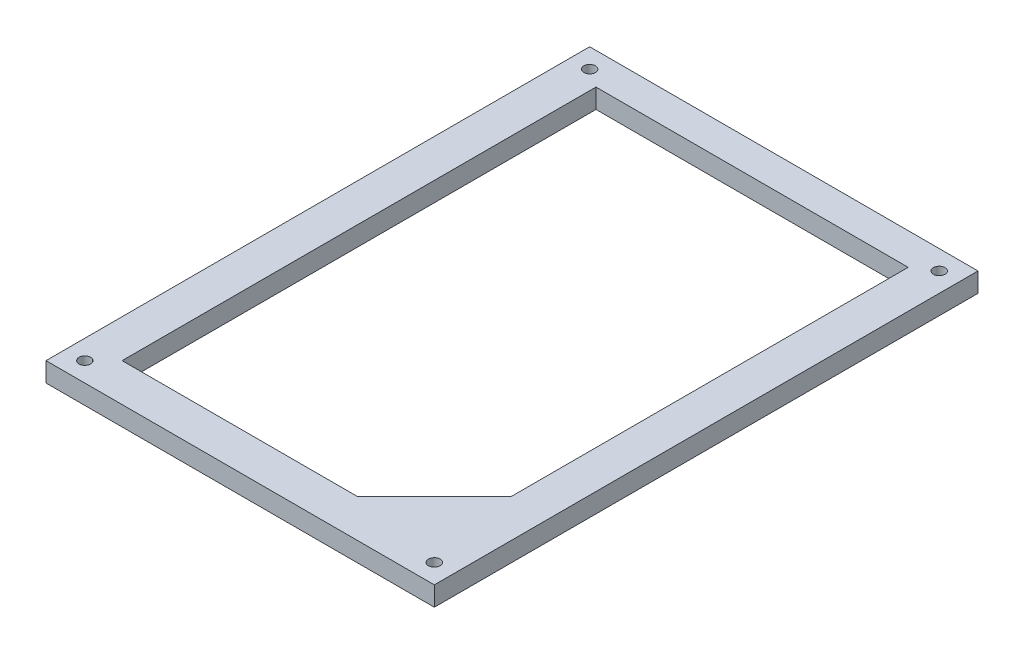
ISO-10303-21;
HEADER;
FILE_DESCRIPTION(('STEP AP214'),'2;1');
FILE_NAME('part.step','',(''),(''),'','','');
FILE_SCHEMA(('AUTOMOTIVE_DESIGN { 1 0 10303 214 1 1 1 1 }'));
ENDSEC;
DATA;
#1=APPLICATION_CONTEXT('core data for automotive mechanical design processes');
#2=APPLICATION_PROTOCOL_DEFINITION('international standard','automotive_design',2000,#1);
#3=PRODUCT_CONTEXT('',#1,'mechanical');
#4=PRODUCT('Part','Part','',(#3));
#5=PRODUCT_RELATED_PRODUCT_CATEGORY('part','',(#4));
#6=PRODUCT_DEFINITION_FORMATION('','',#4);
#7=PRODUCT_DEFINITION_CONTEXT('part definition',#1,'design');
#8=PRODUCT_DEFINITION('design','',#6,#7);
#9=PRODUCT_DEFINITION_SHAPE('','',#8);
#10=(LENGTH_UNIT() NAMED_UNIT(*) SI_UNIT(.MILLI.,.METRE.));
#11=(NAMED_UNIT(*) PLANE_ANGLE_UNIT() SI_UNIT($,.RADIAN.));
#12=(NAMED_UNIT(*) SI_UNIT($,.STERADIAN.) SOLID_ANGLE_UNIT());
#13=UNCERTAINTY_MEASURE_WITH_UNIT(LENGTH_MEASURE(1.E-05),#10,'distance_accuracy_value','');
#14=(GEOMETRIC_REPRESENTATION_CONTEXT(3) GLOBAL_UNCERTAINTY_ASSIGNED_CONTEXT((#13)) GLOBAL_UNIT_ASSIGNED_CONTEXT((#10,
#11,#12)) REPRESENTATION_CONTEXT('',''));
#15=CARTESIAN_POINT('',(0.,0.,0.));
#16=DIRECTION('',(0.,0.,1.));
#17=DIRECTION('',(1.,0.,0.));
#18=AXIS2_PLACEMENT_3D('',#15,#16,#17);
#19=CARTESIAN_POINT('',(0.,6.35,0.));
#20=DIRECTION('',(0.,-1.,0.));
#21=DIRECTION('',(0.,0.,-1.));
#22=AXIS2_PLACEMENT_3D('',#19,#20,#21);
#23=PLANE('',#22);
#24=CARTESIAN_POINT('',(120.65,6.35,-171.45));
#25=DIRECTION('',(0.,1.,0.));
#26=DIRECTION('',(0.,0.,-1.));
#27=AXIS2_PLACEMENT_3D('',#24,#25,#26);
#28=CIRCLE('',#27,1.90499999999998);
#29=CARTESIAN_POINT('',(120.65,6.35,-173.355));
#30=VERTEX_POINT('',#29);
#31=EDGE_CURVE('E272',#30,#30,#28,.T.);
#32=ORIENTED_EDGE('',*,*,#31,.F.);
#33=EDGE_LOOP('',(#32));
#34=FACE_BOUND('',#33,.T.);
#35=CARTESIAN_POINT('',(120.65,6.35,-6.34999999999999));
#36=DIRECTION('',(0.,1.,0.));
#37=DIRECTION('',(0.,0.,1.));
#38=AXIS2_PLACEMENT_3D('',#35,#36,#37);
#39=CIRCLE('',#38,1.90499999999998);
#40=CARTESIAN_POINT('',(120.65,6.35,-4.44500000000002));
#41=VERTEX_POINT('',#40);
#42=EDGE_CURVE('E266',#41,#41,#39,.T.);
#43=ORIENTED_EDGE('',*,*,#42,.F.);
#44=EDGE_LOOP('',(#43));
#45=FACE_BOUND('',#44,.T.);
#46=CARTESIAN_POINT('',(6.35,6.35,-6.34999999999999));
#47=DIRECTION('',(0.,1.,0.));
#48=DIRECTION('',(0.,0.,-1.));
#49=AXIS2_PLACEMENT_3D('',#46,#47,#48);
#50=CIRCLE('',#49,1.90499999999999);
#51=CARTESIAN_POINT('',(6.35,6.35,-8.25499999999999));
#52=VERTEX_POINT('',#51);
#53=EDGE_CURVE('E256',#52,#52,#50,.T.);
#54=ORIENTED_EDGE('',*,*,#53,.F.);
#55=EDGE_LOOP('',(#54));
#56=FACE_BOUND('',#55,.T.);
#57=CARTESIAN_POINT('',(6.35,6.35,-171.45));
#58=DIRECTION('',(0.,1.,0.));
#59=DIRECTION('',(0.,0.,1.));
#60=AXIS2_PLACEMENT_3D('',#57,#58,#59);
#61=CIRCLE('',#60,1.90499999999999);
#62=CARTESIAN_POINT('',(6.35,6.35,-169.545));
#63=VERTEX_POINT('',#62);
#64=EDGE_CURVE('E127',#63,#63,#61,.T.);
#65=ORIENTED_EDGE('',*,*,#64,.F.);
#66=EDGE_LOOP('',(#65));
#67=FACE_BOUND('',#66,.T.);
#68=DIRECTION('',(0.,0.,1.));
#69=VECTOR('',#68,1.);
#70=CARTESIAN_POINT('',(0.,6.35,0.));
#71=LINE('',#70,#69);
#72=CARTESIAN_POINT('',(0.,6.35,-177.8));
#73=VERTEX_POINT('',#72);
#74=CARTESIAN_POINT('',(0.,6.35,0.));
#75=VERTEX_POINT('',#74);
#76=EDGE_CURVE('E151',#73,#75,#71,.T.);
#77=ORIENTED_EDGE('',*,*,#76,.T.);
#78=DIRECTION('',(1.,0.,0.));
#79=VECTOR('',#78,1.);
#80=CARTESIAN_POINT('',(0.,6.35,0.));
#81=LINE('',#80,#79);
#82=CARTESIAN_POINT('',(127.,6.35,0.));
#83=VERTEX_POINT('',#82);
#84=EDGE_CURVE('E154',#75,#83,#81,.T.);
#85=ORIENTED_EDGE('',*,*,#84,.T.);
#86=DIRECTION('',(0.,0.,-1.));
#87=VECTOR('',#86,1.);
#88=CARTESIAN_POINT('',(127.,6.35,0.));
#89=LINE('',#88,#87);
#90=CARTESIAN_POINT('',(127.,6.35,-177.8));
#91=VERTEX_POINT('',#90);
#92=EDGE_CURVE('E157',#83,#91,#89,.T.);
#93=ORIENTED_EDGE('',*,*,#92,.T.);
#94=DIRECTION('',(-1.,0.,0.));
#95=VECTOR('',#94,1.);
#96=CARTESIAN_POINT('',(0.,6.35,-177.8));
#97=LINE('',#96,#95);
#98=EDGE_CURVE('E159',#91,#73,#97,.T.);
#99=ORIENTED_EDGE('',*,*,#98,.T.);
#100=EDGE_LOOP('',(#77,#85,#93,#99));
#101=FACE_BOUND('',#100,.T.);
#102=DIRECTION('',(-0.707106781186548,0.,0.707106781186548));
#103=VECTOR('',#102,1.);
#104=CARTESIAN_POINT('',(38.481,6.35,38.481));
#105=LINE('',#104,#103);
#106=CARTESIAN_POINT('',(114.554,6.35,-37.592));
#107=VERTEX_POINT('',#106);
#108=CARTESIAN_POINT('',(89.408,6.35,-12.446));
#109=VERTEX_POINT('',#108);
#110=EDGE_CURVE('E48',#107,#109,#105,.T.);
#111=ORIENTED_EDGE('',*,*,#110,.T.);
#112=DIRECTION('',(1.,0.,0.));
#113=VECTOR('',#112,1.);
#114=CARTESIAN_POINT('',(0.,6.35,-12.446));
#115=LINE('',#114,#113);
#116=CARTESIAN_POINT('',(12.446,6.35,-12.446));
#117=VERTEX_POINT('',#116);
#118=EDGE_CURVE('E121',#117,#109,#115,.T.);
#119=ORIENTED_EDGE('',*,*,#118,.F.);
#120=DIRECTION('',(0.,0.,1.));
#121=VECTOR('',#120,1.);
#122=CARTESIAN_POINT('',(12.446,6.35,0.));
#123=LINE('',#122,#121);
#124=CARTESIAN_POINT('',(12.446,6.35,-167.411684877131));
#125=VERTEX_POINT('',#124);
#126=EDGE_CURVE('E124',#125,#117,#123,.T.);
#127=ORIENTED_EDGE('',*,*,#126,.F.);
#128=DIRECTION('',(1.,0.,0.));
#129=VECTOR('',#128,1.);
#130=CARTESIAN_POINT('',(0.,6.35,-167.411684877131));
#131=LINE('',#130,#129);
#132=CARTESIAN_POINT('',(114.554,6.35,-167.411684877131));
#133=VERTEX_POINT('',#132);
#134=EDGE_CURVE('E138',#125,#133,#131,.T.);
#135=ORIENTED_EDGE('',*,*,#134,.T.);
#136=DIRECTION('',(0.,0.,1.));
#137=VECTOR('',#136,1.);
#138=CARTESIAN_POINT('',(114.554,6.35,0.));
#139=LINE('',#138,#137);
#140=EDGE_CURVE('E135',#133,#107,#139,.T.);
#141=ORIENTED_EDGE('',*,*,#140,.T.);
#142=EDGE_LOOP('',(#111,#119,#127,#135,#141));
#143=FACE_BOUND('',#142,.T.);
#144=ADVANCED_FACE('F33',(#34,#45,#56,#67,#101,#143),#23,.F.);
#145=CARTESIAN_POINT('',(0.,0.,0.));
#146=DIRECTION('',(0.,-1.,0.));
#147=DIRECTION('',(0.,0.,-1.));
#148=AXIS2_PLACEMENT_3D('',#145,#146,#147);
#149=PLANE('',#148);
#150=CARTESIAN_POINT('',(120.65,0.,-171.45));
#151=DIRECTION('',(0.,1.,0.));
#152=DIRECTION('',(0.,0.,-1.));
#153=AXIS2_PLACEMENT_3D('',#150,#151,#152);
#154=CIRCLE('',#153,1.90499999999998);
#155=CARTESIAN_POINT('',(120.65,0.,-173.355));
#156=VERTEX_POINT('',#155);
#157=EDGE_CURVE('E269',#156,#156,#154,.T.);
#158=ORIENTED_EDGE('',*,*,#157,.T.);
#159=EDGE_LOOP('',(#158));
#160=FACE_BOUND('',#159,.T.);
#161=CARTESIAN_POINT('',(120.65,0.,-6.34999999999999));
#162=DIRECTION('',(0.,1.,0.));
#163=DIRECTION('',(0.,0.,1.));
#164=AXIS2_PLACEMENT_3D('',#161,#162,#163);
#165=CIRCLE('',#164,1.90499999999998);
#166=CARTESIAN_POINT('',(120.65,0.,-4.44500000000002));
#167=VERTEX_POINT('',#166);
#168=EDGE_CURVE('E261',#167,#167,#165,.T.);
#169=ORIENTED_EDGE('',*,*,#168,.T.);
#170=EDGE_LOOP('',(#169));
#171=FACE_BOUND('',#170,.T.);
#172=CARTESIAN_POINT('',(6.35,0.,-6.34999999999999));
#173=DIRECTION('',(0.,1.,0.));
#174=DIRECTION('',(0.,0.,-1.));
#175=AXIS2_PLACEMENT_3D('',#172,#173,#174);
#176=CIRCLE('',#175,1.90499999999999);
#177=CARTESIAN_POINT('',(6.35,0.,-8.25499999999999));
#178=VERTEX_POINT('',#177);
#179=EDGE_CURVE('E254',#178,#178,#176,.T.);
#180=ORIENTED_EDGE('',*,*,#179,.T.);
#181=EDGE_LOOP('',(#180));
#182=FACE_BOUND('',#181,.T.);
#183=CARTESIAN_POINT('',(6.35,0.,-171.45));
#184=DIRECTION('',(0.,1.,0.));
#185=DIRECTION('',(0.,0.,1.));
#186=AXIS2_PLACEMENT_3D('',#183,#184,#185);
#187=CIRCLE('',#186,1.90499999999999);
#188=CARTESIAN_POINT('',(6.35,0.,-169.545));
#189=VERTEX_POINT('',#188);
#190=EDGE_CURVE('E136',#189,#189,#187,.T.);
#191=ORIENTED_EDGE('',*,*,#190,.T.);
#192=EDGE_LOOP('',(#191));
#193=FACE_BOUND('',#192,.T.);
#194=DIRECTION('',(0.,0.,1.));
#195=VECTOR('',#194,1.);
#196=CARTESIAN_POINT('',(0.,0.,0.));
#197=LINE('',#196,#195);
#198=CARTESIAN_POINT('',(0.,0.,-177.8));
#199=VERTEX_POINT('',#198);
#200=CARTESIAN_POINT('',(0.,0.,0.));
#201=VERTEX_POINT('',#200);
#202=EDGE_CURVE('E145',#199,#201,#197,.T.);
#203=ORIENTED_EDGE('',*,*,#202,.F.);
#204=DIRECTION('',(-1.,0.,0.));
#205=VECTOR('',#204,1.);
#206=CARTESIAN_POINT('',(0.,0.,-177.8));
#207=LINE('',#206,#205);
#208=CARTESIAN_POINT('',(127.,0.,-177.8));
#209=VERTEX_POINT('',#208);
#210=EDGE_CURVE('E155',#209,#199,#207,.T.);
#211=ORIENTED_EDGE('',*,*,#210,.F.);
#212=DIRECTION('',(0.,0.,-1.));
#213=VECTOR('',#212,1.);
#214=CARTESIAN_POINT('',(127.,0.,0.));
#215=LINE('',#214,#213);
#216=CARTESIAN_POINT('',(127.,0.,0.));
#217=VERTEX_POINT('',#216);
#218=EDGE_CURVE('E166',#217,#209,#215,.T.);
#219=ORIENTED_EDGE('',*,*,#218,.F.);
#220=DIRECTION('',(1.,0.,0.));
#221=VECTOR('',#220,1.);
#222=CARTESIAN_POINT('',(0.,0.,0.));
#223=LINE('',#222,#221);
#224=EDGE_CURVE('E164',#201,#217,#223,.T.);
#225=ORIENTED_EDGE('',*,*,#224,.F.);
#226=EDGE_LOOP('',(#203,#211,#219,#225));
#227=FACE_BOUND('',#226,.T.);
#228=DIRECTION('',(1.,0.,0.));
#229=VECTOR('',#228,1.);
#230=CARTESIAN_POINT('',(0.,0.,-12.446));
#231=LINE('',#230,#229);
#232=CARTESIAN_POINT('',(12.446,0.,-12.446));
#233=VERTEX_POINT('',#232);
#234=CARTESIAN_POINT('',(89.408,0.,-12.446));
#235=VERTEX_POINT('',#234);
#236=EDGE_CURVE('E115',#233,#235,#231,.T.);
#237=ORIENTED_EDGE('',*,*,#236,.T.);
#238=DIRECTION('',(-0.707106781186548,0.,0.707106781186548));
#239=VECTOR('',#238,1.);
#240=CARTESIAN_POINT('',(38.481,0.,38.481));
#241=LINE('',#240,#239);
#242=CARTESIAN_POINT('',(114.554,0.,-37.592));
#243=VERTEX_POINT('',#242);
#244=EDGE_CURVE('E111',#243,#235,#241,.T.);
#245=ORIENTED_EDGE('',*,*,#244,.F.);
#246=DIRECTION('',(0.,0.,1.));
#247=VECTOR('',#246,1.);
#248=CARTESIAN_POINT('',(114.554,0.,0.));
#249=LINE('',#248,#247);
#250=CARTESIAN_POINT('',(114.554,0.,-167.411684877131));
#251=VERTEX_POINT('',#250);
#252=EDGE_CURVE('E103',#251,#243,#249,.T.);
#253=ORIENTED_EDGE('',*,*,#252,.F.);
#254=DIRECTION('',(1.,0.,0.));
#255=VECTOR('',#254,1.);
#256=CARTESIAN_POINT('',(0.,0.,-167.411684877131));
#257=LINE('',#256,#255);
#258=CARTESIAN_POINT('',(12.446,0.,-167.411684877131));
#259=VERTEX_POINT('',#258);
#260=EDGE_CURVE('E110',#259,#251,#257,.T.);
#261=ORIENTED_EDGE('',*,*,#260,.F.);
#262=DIRECTION('',(0.,0.,1.));
#263=VECTOR('',#262,1.);
#264=CARTESIAN_POINT('',(12.446,0.,0.));
#265=LINE('',#264,#263);
#266=EDGE_CURVE('E131',#259,#233,#265,.T.);
#267=ORIENTED_EDGE('',*,*,#266,.T.);
#268=EDGE_LOOP('',(#237,#245,#253,#261,#267));
#269=FACE_BOUND('',#268,.T.);
#270=ADVANCED_FACE('F118',(#160,#171,#182,#193,#227,#269),#149,.T.);
#271=CARTESIAN_POINT('',(0.,6.35,0.));
#272=DIRECTION('',(1.,0.,0.));
#273=DIRECTION('',(0.,0.,-1.));
#274=AXIS2_PLACEMENT_3D('',#271,#272,#273);
#275=PLANE('',#274);
#276=ORIENTED_EDGE('',*,*,#202,.T.);
#277=DIRECTION('',(0.,-1.,0.));
#278=VECTOR('',#277,1.);
#279=CARTESIAN_POINT('',(0.,6.35,0.));
#280=LINE('',#279,#278);
#281=EDGE_CURVE('E11',#75,#201,#280,.T.);
#282=ORIENTED_EDGE('',*,*,#281,.F.);
#283=ORIENTED_EDGE('',*,*,#76,.F.);
#284=DIRECTION('',(0.,-1.,0.));
#285=VECTOR('',#284,1.);
#286=CARTESIAN_POINT('',(0.,6.35,-177.8));
#287=LINE('',#286,#285);
#288=EDGE_CURVE('E161',#73,#199,#287,.T.);
#289=ORIENTED_EDGE('',*,*,#288,.T.);
#290=EDGE_LOOP('',(#276,#282,#283,#289));
#291=FACE_BOUND('',#290,.T.);
#292=ADVANCED_FACE('F35',(#291),#275,.F.);
#293=CARTESIAN_POINT('',(0.,6.35,0.));
#294=DIRECTION('',(0.,0.,-1.));
#295=DIRECTION('',(-1.,0.,0.));
#296=AXIS2_PLACEMENT_3D('',#293,#294,#295);
#297=PLANE('',#296);
#298=ORIENTED_EDGE('',*,*,#224,.T.);
#299=DIRECTION('',(0.,-1.,0.));
#300=VECTOR('',#299,1.);
#301=CARTESIAN_POINT('',(127.,6.35,0.));
#302=LINE('',#301,#300);
#303=EDGE_CURVE('E41',#83,#217,#302,.T.);
#304=ORIENTED_EDGE('',*,*,#303,.F.);
#305=ORIENTED_EDGE('',*,*,#84,.F.);
#306=ORIENTED_EDGE('',*,*,#281,.T.);
#307=EDGE_LOOP('',(#298,#304,#305,#306));
#308=FACE_BOUND('',#307,.T.);
#309=ADVANCED_FACE('F193',(#308),#297,.F.);
#310=CARTESIAN_POINT('',(127.,6.35,0.));
#311=DIRECTION('',(-1.,0.,0.));
#312=DIRECTION('',(0.,0.,1.));
#313=AXIS2_PLACEMENT_3D('',#310,#311,#312);
#314=PLANE('',#313);
#315=ORIENTED_EDGE('',*,*,#218,.T.);
#316=DIRECTION('',(0.,-1.,0.));
#317=VECTOR('',#316,1.);
#318=CARTESIAN_POINT('',(127.,6.35,-177.8));
#319=LINE('',#318,#317);
#320=EDGE_CURVE('E171',#91,#209,#319,.T.);
#321=ORIENTED_EDGE('',*,*,#320,.F.);
#322=ORIENTED_EDGE('',*,*,#92,.F.);
#323=ORIENTED_EDGE('',*,*,#303,.T.);
#324=EDGE_LOOP('',(#315,#321,#322,#323));
#325=FACE_BOUND('',#324,.T.);
#326=ADVANCED_FACE('F178',(#325),#314,.F.);
#327=CARTESIAN_POINT('',(0.,6.35,-177.8));
#328=DIRECTION('',(0.,0.,1.));
#329=DIRECTION('',(1.,0.,0.));
#330=AXIS2_PLACEMENT_3D('',#327,#328,#329);
#331=PLANE('',#330);
#332=ORIENTED_EDGE('',*,*,#210,.T.);
#333=ORIENTED_EDGE('',*,*,#288,.F.);
#334=ORIENTED_EDGE('',*,*,#98,.F.);
#335=ORIENTED_EDGE('',*,*,#320,.T.);
#336=EDGE_LOOP('',(#332,#333,#334,#335));
#337=FACE_BOUND('',#336,.T.);
#338=ADVANCED_FACE('F186',(#337),#331,.F.);
#339=CARTESIAN_POINT('',(38.481,0.,38.481));
#340=DIRECTION('',(-0.707106781186548,0.,-0.707106781186548));
#341=DIRECTION('',(-0.707106781186548,0.,0.707106781186548));
#342=AXIS2_PLACEMENT_3D('',#339,#340,#341);
#343=PLANE('',#342);
#344=ORIENTED_EDGE('',*,*,#110,.F.);
#345=DIRECTION('',(0.,1.,0.));
#346=VECTOR('',#345,1.);
#347=CARTESIAN_POINT('',(114.554,0.,-37.592));
#348=LINE('',#347,#346);
#349=EDGE_CURVE('E105',#243,#107,#348,.T.);
#350=ORIENTED_EDGE('',*,*,#349,.F.);
#351=ORIENTED_EDGE('',*,*,#244,.T.);
#352=DIRECTION('',(0.,1.,0.));
#353=VECTOR('',#352,1.);
#354=CARTESIAN_POINT('',(89.408,0.,-12.446));
#355=LINE('',#354,#353);
#356=EDGE_CURVE('E143',#235,#109,#355,.T.);
#357=ORIENTED_EDGE('',*,*,#356,.T.);
#358=EDGE_LOOP('',(#344,#350,#351,#357));
#359=FACE_BOUND('',#358,.T.);
#360=ADVANCED_FACE('F113',(#359),#343,.T.);
#361=CARTESIAN_POINT('',(0.,0.,-12.446));
#362=DIRECTION('',(0.,0.,1.));
#363=DIRECTION('',(1.,0.,0.));
#364=AXIS2_PLACEMENT_3D('',#361,#362,#363);
#365=PLANE('',#364);
#366=ORIENTED_EDGE('',*,*,#118,.T.);
#367=ORIENTED_EDGE('',*,*,#356,.F.);
#368=ORIENTED_EDGE('',*,*,#236,.F.);
#369=DIRECTION('',(0.,1.,0.));
#370=VECTOR('',#369,1.);
#371=CARTESIAN_POINT('',(12.446,0.,-12.446));
#372=LINE('',#371,#370);
#373=EDGE_CURVE('E146',#233,#117,#372,.T.);
#374=ORIENTED_EDGE('',*,*,#373,.T.);
#375=EDGE_LOOP('',(#366,#367,#368,#374));
#376=FACE_BOUND('',#375,.T.);
#377=ADVANCED_FACE('F217',(#376),#365,.F.);
#378=CARTESIAN_POINT('',(12.446,0.,0.));
#379=DIRECTION('',(-1.,0.,0.));
#380=DIRECTION('',(0.,0.,1.));
#381=AXIS2_PLACEMENT_3D('',#378,#379,#380);
#382=PLANE('',#381);
#383=ORIENTED_EDGE('',*,*,#126,.T.);
#384=ORIENTED_EDGE('',*,*,#373,.F.);
#385=ORIENTED_EDGE('',*,*,#266,.F.);
#386=DIRECTION('',(0.,1.,0.));
#387=VECTOR('',#386,1.);
#388=CARTESIAN_POINT('',(12.446,0.,-167.411684877131));
#389=LINE('',#388,#387);
#390=EDGE_CURVE('E148',#259,#125,#389,.T.);
#391=ORIENTED_EDGE('',*,*,#390,.T.);
#392=EDGE_LOOP('',(#383,#384,#385,#391));
#393=FACE_BOUND('',#392,.T.);
#394=ADVANCED_FACE('F221',(#393),#382,.F.);
#395=CARTESIAN_POINT('',(0.,0.,-167.411684877131));
#396=DIRECTION('',(0.,0.,1.));
#397=DIRECTION('',(1.,0.,0.));
#398=AXIS2_PLACEMENT_3D('',#395,#396,#397);
#399=PLANE('',#398);
#400=ORIENTED_EDGE('',*,*,#134,.F.);
#401=ORIENTED_EDGE('',*,*,#390,.F.);
#402=ORIENTED_EDGE('',*,*,#260,.T.);
#403=DIRECTION('',(0.,1.,0.));
#404=VECTOR('',#403,1.);
#405=CARTESIAN_POINT('',(114.554,0.,-167.411684877131));
#406=LINE('',#405,#404);
#407=EDGE_CURVE('E56',#251,#133,#406,.T.);
#408=ORIENTED_EDGE('',*,*,#407,.T.);
#409=EDGE_LOOP('',(#400,#401,#402,#408));
#410=FACE_BOUND('',#409,.T.);
#411=ADVANCED_FACE('F227',(#410),#399,.T.);
#412=CARTESIAN_POINT('',(114.554,0.,0.));
#413=DIRECTION('',(-1.,0.,0.));
#414=DIRECTION('',(0.,0.,1.));
#415=AXIS2_PLACEMENT_3D('',#412,#413,#414);
#416=PLANE('',#415);
#417=ORIENTED_EDGE('',*,*,#140,.F.);
#418=ORIENTED_EDGE('',*,*,#407,.F.);
#419=ORIENTED_EDGE('',*,*,#252,.T.);
#420=ORIENTED_EDGE('',*,*,#349,.T.);
#421=EDGE_LOOP('',(#417,#418,#419,#420));
#422=FACE_BOUND('',#421,.T.);
#423=ADVANCED_FACE('F104',(#422),#416,.T.);
#424=CARTESIAN_POINT('',(6.35,0.,-171.45));
#425=DIRECTION('',(0.,1.,0.));
#426=DIRECTION('',(0.,0.,1.));
#427=AXIS2_PLACEMENT_3D('',#424,#425,#426);
#428=CYLINDRICAL_SURFACE('',#427,1.90499999999999);
#429=ORIENTED_EDGE('',*,*,#190,.F.);
#430=EDGE_LOOP('',(#429));
#431=FACE_BOUND('',#430,.T.);
#432=ORIENTED_EDGE('',*,*,#64,.T.);
#433=EDGE_LOOP('',(#432));
#434=FACE_BOUND('',#433,.T.);
#435=ADVANCED_FACE('F231',(#431,#434),#428,.F.);
#436=CARTESIAN_POINT('',(6.35,0.,-6.34999999999999));
#437=DIRECTION('',(0.,1.,0.));
#438=DIRECTION('',(0.,0.,1.));
#439=AXIS2_PLACEMENT_3D('',#436,#437,#438);
#440=CYLINDRICAL_SURFACE('',#439,1.90499999999999);
#441=ORIENTED_EDGE('',*,*,#179,.F.);
#442=EDGE_LOOP('',(#441));
#443=FACE_BOUND('',#442,.T.);
#444=ORIENTED_EDGE('',*,*,#53,.T.);
#445=EDGE_LOOP('',(#444));
#446=FACE_BOUND('',#445,.T.);
#447=ADVANCED_FACE('F240',(#443,#446),#440,.F.);
#448=CARTESIAN_POINT('',(120.65,0.,-6.34999999999999));
#449=DIRECTION('',(0.,1.,0.));
#450=DIRECTION('',(0.,0.,1.));
#451=AXIS2_PLACEMENT_3D('',#448,#449,#450);
#452=CYLINDRICAL_SURFACE('',#451,1.90499999999998);
#453=ORIENTED_EDGE('',*,*,#168,.F.);
#454=EDGE_LOOP('',(#453));
#455=FACE_BOUND('',#454,.T.);
#456=ORIENTED_EDGE('',*,*,#42,.T.);
#457=EDGE_LOOP('',(#456));
#458=FACE_BOUND('',#457,.T.);
#459=ADVANCED_FACE('F245',(#455,#458),#452,.F.);
#460=CARTESIAN_POINT('',(120.65,0.,-171.45));
#461=DIRECTION('',(0.,1.,0.));
#462=DIRECTION('',(0.,0.,1.));
#463=AXIS2_PLACEMENT_3D('',#460,#461,#462);
#464=CYLINDRICAL_SURFACE('',#463,1.90499999999998);
#465=ORIENTED_EDGE('',*,*,#157,.F.);
#466=EDGE_LOOP('',(#465));
#467=FACE_BOUND('',#466,.T.);
#468=ORIENTED_EDGE('',*,*,#31,.T.);
#469=EDGE_LOOP('',(#468));
#470=FACE_BOUND('',#469,.T.);
#471=ADVANCED_FACE('F275',(#467,#470),#464,.F.);
#472=CLOSED_SHELL('',(#144,#270,#292,#309,#326,#338,#360,#377,#394,#411,#423,#435,#447,#459,#471));
#473=MANIFOLD_SOLID_BREP('B2',#472);
#474=ADVANCED_BREP_SHAPE_REPRESENTATION('',(#18,#473),#14);
#475=SHAPE_DEFINITION_REPRESENTATION(#9,#474);
ENDSEC;
END-ISO-10303-21;
